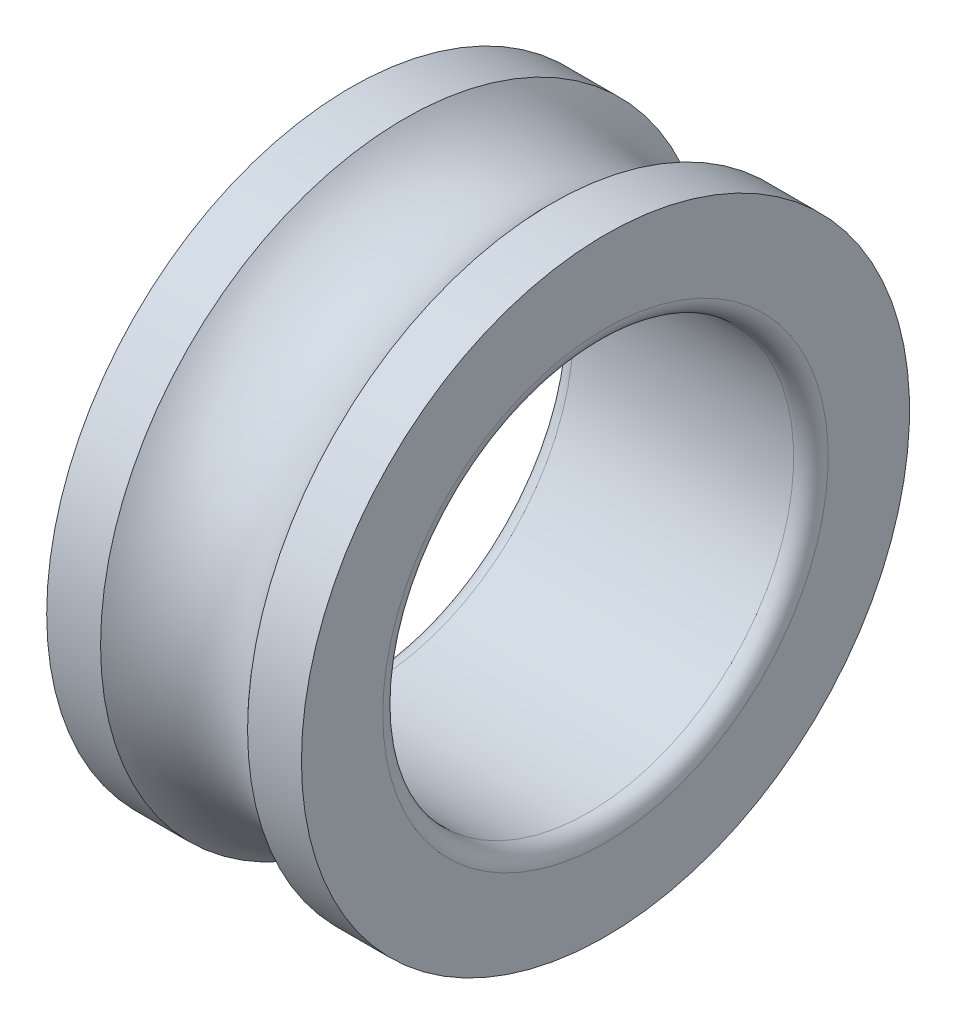
ISO-10303-21;
HEADER;
FILE_DESCRIPTION(('STEP AP214'),'2;1');
FILE_NAME('part.step','',(''),(''),'','','');
FILE_SCHEMA(('AUTOMOTIVE_DESIGN { 1 0 10303 214 1 1 1 1 }'));
ENDSEC;
DATA;
#1=APPLICATION_CONTEXT('core data for automotive mechanical design processes');
#2=APPLICATION_PROTOCOL_DEFINITION('international standard','automotive_design',2000,#1);
#3=PRODUCT_CONTEXT('',#1,'mechanical');
#4=PRODUCT('Part','Part','',(#3));
#5=PRODUCT_RELATED_PRODUCT_CATEGORY('part','',(#4));
#6=PRODUCT_DEFINITION_FORMATION('','',#4);
#7=PRODUCT_DEFINITION_CONTEXT('part definition',#1,'design');
#8=PRODUCT_DEFINITION('design','',#6,#7);
#9=PRODUCT_DEFINITION_SHAPE('','',#8);
#10=(LENGTH_UNIT() NAMED_UNIT(*) SI_UNIT(.MILLI.,.METRE.));
#11=(NAMED_UNIT(*) PLANE_ANGLE_UNIT() SI_UNIT($,.RADIAN.));
#12=(NAMED_UNIT(*) SI_UNIT($,.STERADIAN.) SOLID_ANGLE_UNIT());
#13=UNCERTAINTY_MEASURE_WITH_UNIT(LENGTH_MEASURE(1.E-05),#10,'distance_accuracy_value','');
#14=(GEOMETRIC_REPRESENTATION_CONTEXT(3) GLOBAL_UNCERTAINTY_ASSIGNED_CONTEXT((#13)) GLOBAL_UNIT_ASSIGNED_CONTEXT((#10,
#11,#12)) REPRESENTATION_CONTEXT('',''));
#15=CARTESIAN_POINT('',(0.,0.,0.));
#16=DIRECTION('',(0.,0.,1.));
#17=DIRECTION('',(1.,0.,0.));
#18=AXIS2_PLACEMENT_3D('',#15,#16,#17);
#19=CARTESIAN_POINT('',(0.,0.,0.));
#20=DIRECTION('',(-1.,0.,0.));
#21=DIRECTION('',(0.,0.,1.));
#22=AXIS2_PLACEMENT_3D('',#19,#20,#21);
#23=CYLINDRICAL_SURFACE('',#22,37.);
#24=CARTESIAN_POINT('',(8.94427190999916,0.,0.));
#25=DIRECTION('',(-1.,0.,0.));
#26=DIRECTION('',(0.,0.,1.));
#27=AXIS2_PLACEMENT_3D('',#24,#25,#26);
#28=CIRCLE('',#27,37.);
#29=CARTESIAN_POINT('',(8.94427190999916,0.,37.));
#30=VERTEX_POINT('',#29);
#31=EDGE_CURVE('E10',#30,#30,#28,.T.);
#32=ORIENTED_EDGE('',*,*,#31,.F.);
#33=EDGE_LOOP('',(#32));
#34=FACE_BOUND('',#33,.T.);
#35=CARTESIAN_POINT('',(15.5,0.,0.));
#36=DIRECTION('',(-1.,0.,0.));
#37=DIRECTION('',(0.,0.,1.));
#38=AXIS2_PLACEMENT_3D('',#35,#36,#37);
#39=CIRCLE('',#38,37.);
#40=CARTESIAN_POINT('',(15.5,0.,37.));
#41=VERTEX_POINT('',#40);
#42=EDGE_CURVE('E59',#41,#41,#39,.T.);
#43=ORIENTED_EDGE('',*,*,#42,.T.);
#44=EDGE_LOOP('',(#43));
#45=FACE_BOUND('',#44,.T.);
#46=ADVANCED_FACE('F31',(#34,#45),#23,.T.);
#47=CARTESIAN_POINT('',(0.,0.,0.));
#48=DIRECTION('',(-1.,0.,0.));
#49=DIRECTION('',(0.,0.,1.));
#50=AXIS2_PLACEMENT_3D('',#47,#48,#49);
#51=TOROIDAL_SURFACE('',#50,45.,12.);
#52=CARTESIAN_POINT('',(-8.94427190999916,0.,0.));
#53=DIRECTION('',(-1.,0.,0.));
#54=DIRECTION('',(0.,0.,1.));
#55=AXIS2_PLACEMENT_3D('',#52,#53,#54);
#56=CIRCLE('',#55,37.);
#57=CARTESIAN_POINT('',(-8.94427190999916,0.,37.));
#58=VERTEX_POINT('',#57);
#59=EDGE_CURVE('E37',#58,#58,#56,.T.);
#60=ORIENTED_EDGE('',*,*,#59,.F.);
#61=EDGE_LOOP('',(#60));
#62=FACE_BOUND('',#61,.T.);
#63=ORIENTED_EDGE('',*,*,#31,.T.);
#64=EDGE_LOOP('',(#63));
#65=FACE_BOUND('',#64,.T.);
#66=ADVANCED_FACE('F96',(#62,#65),#51,.F.);
#67=CARTESIAN_POINT('',(0.,0.,0.));
#68=DIRECTION('',(-1.,0.,0.));
#69=DIRECTION('',(0.,0.,1.));
#70=AXIS2_PLACEMENT_3D('',#67,#68,#69);
#71=CYLINDRICAL_SURFACE('',#70,37.);
#72=CARTESIAN_POINT('',(-15.5,0.,0.));
#73=DIRECTION('',(-1.,0.,0.));
#74=DIRECTION('',(0.,0.,1.));
#75=AXIS2_PLACEMENT_3D('',#72,#73,#74);
#76=CIRCLE('',#75,37.);
#77=CARTESIAN_POINT('',(-15.5,0.,37.));
#78=VERTEX_POINT('',#77);
#79=EDGE_CURVE('E41',#78,#78,#76,.T.);
#80=ORIENTED_EDGE('',*,*,#79,.F.);
#81=EDGE_LOOP('',(#80));
#82=FACE_BOUND('',#81,.T.);
#83=ORIENTED_EDGE('',*,*,#59,.T.);
#84=EDGE_LOOP('',(#83));
#85=FACE_BOUND('',#84,.T.);
#86=ADVANCED_FACE('F91',(#82,#85),#71,.T.);
#87=CARTESIAN_POINT('',(-15.5,27.1,0.));
#88=DIRECTION('',(1.,0.,0.));
#89=DIRECTION('',(0.,0.,-1.));
#90=AXIS2_PLACEMENT_3D('',#87,#88,#89);
#91=PLANE('',#90);
#92=CARTESIAN_POINT('',(-15.5,0.,0.));
#93=DIRECTION('',(-1.,0.,0.));
#94=DIRECTION('',(0.,0.,1.));
#95=AXIS2_PLACEMENT_3D('',#92,#93,#94);
#96=CIRCLE('',#95,27.1);
#97=CARTESIAN_POINT('',(-15.5,0.,27.1));
#98=VERTEX_POINT('',#97);
#99=EDGE_CURVE('E45',#98,#98,#96,.T.);
#100=ORIENTED_EDGE('',*,*,#99,.F.);
#101=EDGE_LOOP('',(#100));
#102=FACE_BOUND('',#101,.T.);
#103=ORIENTED_EDGE('',*,*,#79,.T.);
#104=EDGE_LOOP('',(#103));
#105=FACE_BOUND('',#104,.T.);
#106=ADVANCED_FACE('F85',(#102,#105),#91,.F.);
#107=CARTESIAN_POINT('',(-13.4,0.,0.));
#108=DIRECTION('',(-1.,0.,0.));
#109=DIRECTION('',(0.,0.,1.));
#110=AXIS2_PLACEMENT_3D('',#107,#108,#109);
#111=TOROIDAL_SURFACE('',#110,27.1,2.1);
#112=CARTESIAN_POINT('',(-13.4,0.,0.));
#113=DIRECTION('',(-1.,0.,0.));
#114=DIRECTION('',(0.,0.,1.));
#115=AXIS2_PLACEMENT_3D('',#112,#113,#114);
#116=CIRCLE('',#115,25.);
#117=CARTESIAN_POINT('',(-13.4,0.,25.));
#118=VERTEX_POINT('',#117);
#119=EDGE_CURVE('E50',#118,#118,#116,.T.);
#120=ORIENTED_EDGE('',*,*,#119,.F.);
#121=EDGE_LOOP('',(#120));
#122=FACE_BOUND('',#121,.T.);
#123=ORIENTED_EDGE('',*,*,#99,.T.);
#124=EDGE_LOOP('',(#123));
#125=FACE_BOUND('',#124,.T.);
#126=ADVANCED_FACE('F79',(#122,#125),#111,.T.);
#127=CARTESIAN_POINT('',(0.,0.,0.));
#128=DIRECTION('',(-1.,0.,0.));
#129=DIRECTION('',(0.,0.,1.));
#130=AXIS2_PLACEMENT_3D('',#127,#128,#129);
#131=CYLINDRICAL_SURFACE('',#130,25.);
#132=CARTESIAN_POINT('',(13.4,0.,0.));
#133=DIRECTION('',(-1.,0.,0.));
#134=DIRECTION('',(0.,0.,1.));
#135=AXIS2_PLACEMENT_3D('',#132,#133,#134);
#136=CIRCLE('',#135,25.);
#137=CARTESIAN_POINT('',(13.4,0.,25.));
#138=VERTEX_POINT('',#137);
#139=EDGE_CURVE('E53',#138,#138,#136,.T.);
#140=ORIENTED_EDGE('',*,*,#139,.F.);
#141=EDGE_LOOP('',(#140));
#142=FACE_BOUND('',#141,.T.);
#143=ORIENTED_EDGE('',*,*,#119,.T.);
#144=EDGE_LOOP('',(#143));
#145=FACE_BOUND('',#144,.T.);
#146=ADVANCED_FACE('F73',(#142,#145),#131,.F.);
#147=CARTESIAN_POINT('',(13.4,0.,0.));
#148=DIRECTION('',(-1.,0.,0.));
#149=DIRECTION('',(0.,0.,1.));
#150=AXIS2_PLACEMENT_3D('',#147,#148,#149);
#151=TOROIDAL_SURFACE('',#150,27.1,2.1);
#152=CARTESIAN_POINT('',(15.5,0.,0.));
#153=DIRECTION('',(-1.,0.,0.));
#154=DIRECTION('',(0.,0.,1.));
#155=AXIS2_PLACEMENT_3D('',#152,#153,#154);
#156=CIRCLE('',#155,27.1);
#157=CARTESIAN_POINT('',(15.5,0.,27.1));
#158=VERTEX_POINT('',#157);
#159=EDGE_CURVE('E56',#158,#158,#156,.T.);
#160=ORIENTED_EDGE('',*,*,#159,.F.);
#161=EDGE_LOOP('',(#160));
#162=FACE_BOUND('',#161,.T.);
#163=ORIENTED_EDGE('',*,*,#139,.T.);
#164=EDGE_LOOP('',(#163));
#165=FACE_BOUND('',#164,.T.);
#166=ADVANCED_FACE('F67',(#162,#165),#151,.T.);
#167=CARTESIAN_POINT('',(15.5,27.1,0.));
#168=DIRECTION('',(-1.,0.,0.));
#169=DIRECTION('',(0.,0.,1.));
#170=AXIS2_PLACEMENT_3D('',#167,#168,#169);
#171=PLANE('',#170);
#172=ORIENTED_EDGE('',*,*,#42,.F.);
#173=EDGE_LOOP('',(#172));
#174=FACE_BOUND('',#173,.T.);
#175=ORIENTED_EDGE('',*,*,#159,.T.);
#176=EDGE_LOOP('',(#175));
#177=FACE_BOUND('',#176,.T.);
#178=ADVANCED_FACE('F64',(#174,#177),#171,.F.);
#179=CLOSED_SHELL('',(#46,#66,#86,#106,#126,#146,#166,#178));
#180=MANIFOLD_SOLID_BREP('B2',#179);
#181=ADVANCED_BREP_SHAPE_REPRESENTATION('',(#18,#180),#14);
#182=SHAPE_DEFINITION_REPRESENTATION(#9,#181);
ENDSEC;
END-ISO-10303-21;
